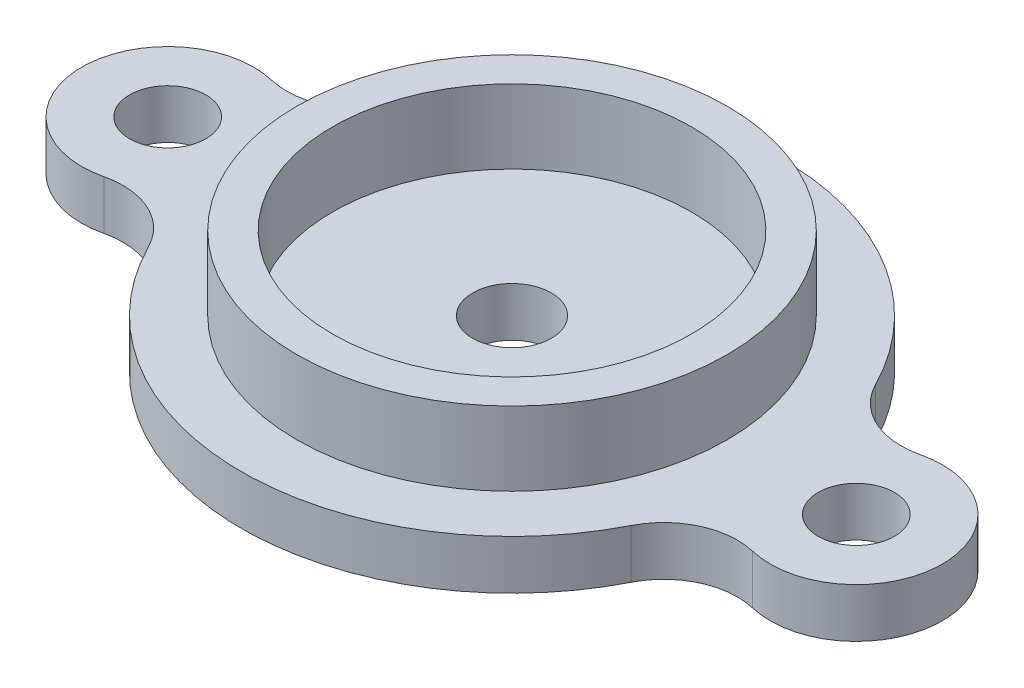
ISO-10303-21;
HEADER;
FILE_DESCRIPTION(('STEP AP214'),'2;1');
FILE_NAME('part.step','',(''),(''),'','','');
FILE_SCHEMA(('AUTOMOTIVE_DESIGN { 1 0 10303 214 1 1 1 1 }'));
ENDSEC;
DATA;
#1=APPLICATION_CONTEXT('core data for automotive mechanical design processes');
#2=APPLICATION_PROTOCOL_DEFINITION('international standard','automotive_design',2000,#1);
#3=PRODUCT_CONTEXT('',#1,'mechanical');
#4=PRODUCT('Part','Part','',(#3));
#5=PRODUCT_RELATED_PRODUCT_CATEGORY('part','',(#4));
#6=PRODUCT_DEFINITION_FORMATION('','',#4);
#7=PRODUCT_DEFINITION_CONTEXT('part definition',#1,'design');
#8=PRODUCT_DEFINITION('design','',#6,#7);
#9=PRODUCT_DEFINITION_SHAPE('','',#8);
#10=(LENGTH_UNIT() NAMED_UNIT(*) SI_UNIT(.MILLI.,.METRE.));
#11=(NAMED_UNIT(*) PLANE_ANGLE_UNIT() SI_UNIT($,.RADIAN.));
#12=(NAMED_UNIT(*) SI_UNIT($,.STERADIAN.) SOLID_ANGLE_UNIT());
#13=UNCERTAINTY_MEASURE_WITH_UNIT(LENGTH_MEASURE(1.E-05),#10,'distance_accuracy_value','');
#14=(GEOMETRIC_REPRESENTATION_CONTEXT(3) GLOBAL_UNCERTAINTY_ASSIGNED_CONTEXT((#13)) GLOBAL_UNIT_ASSIGNED_CONTEXT((#10,
#11,#12)) REPRESENTATION_CONTEXT('',''));
#15=CARTESIAN_POINT('',(0.,0.,0.));
#16=DIRECTION('',(0.,0.,1.));
#17=DIRECTION('',(1.,0.,0.));
#18=AXIS2_PLACEMENT_3D('',#15,#16,#17);
#19=CARTESIAN_POINT('',(0.,2.,0.));
#20=DIRECTION('',(0.,1.,0.));
#21=DIRECTION('',(0.,0.,1.));
#22=AXIS2_PLACEMENT_3D('',#19,#20,#21);
#23=PLANE('',#22);
#24=CARTESIAN_POINT('',(0.,2.,0.));
#25=DIRECTION('',(0.,1.,0.));
#26=DIRECTION('',(0.,0.,1.));
#27=AXIS2_PLACEMENT_3D('',#24,#25,#26);
#28=CIRCLE('',#27,1.6);
#29=CARTESIAN_POINT('',(0.,2.,1.6));
#30=VERTEX_POINT('',#29);
#31=EDGE_CURVE('E199',#30,#30,#28,.F.);
#32=ORIENTED_EDGE('',*,*,#31,.T.);
#33=EDGE_LOOP('',(#32));
#34=FACE_BOUND('',#33,.T.);
#35=CARTESIAN_POINT('',(0.,2.,0.));
#36=DIRECTION('',(0.,1.,0.));
#37=DIRECTION('',(0.,0.,1.));
#38=AXIS2_PLACEMENT_3D('',#35,#36,#37);
#39=CIRCLE('',#38,7.3);
#40=CARTESIAN_POINT('',(0.,2.,7.3));
#41=VERTEX_POINT('',#40);
#42=EDGE_CURVE('E11',#41,#41,#39,.F.);
#43=ORIENTED_EDGE('',*,*,#42,.F.);
#44=EDGE_LOOP('',(#43));
#45=FACE_BOUND('',#44,.T.);
#46=ADVANCED_FACE('F34',(#34,#45),#23,.T.);
#47=CARTESIAN_POINT('',(0.,2.,0.));
#48=DIRECTION('',(0.,-1.,0.));
#49=DIRECTION('',(0.,0.,-1.));
#50=AXIS2_PLACEMENT_3D('',#47,#48,#49);
#51=CYLINDRICAL_SURFACE('',#50,11.);
#52=DIRECTION('',(0.,1.,0.));
#53=VECTOR('',#52,1.);
#54=CARTESIAN_POINT('',(9.8144132653061,-12.5609479135786,-4.96762440788186));
#55=LINE('',#54,#53);
#56=CARTESIAN_POINT('',(9.8144132653061,0.,-4.96762440788186));
#57=VERTEX_POINT('',#56);
#58=CARTESIAN_POINT('',(9.8144132653061,2.,-4.96762440788186));
#59=VERTEX_POINT('',#58);
#60=EDGE_CURVE('E111',#57,#59,#55,.T.);
#61=ORIENTED_EDGE('',*,*,#60,.F.);
#62=CARTESIAN_POINT('',(0.,0.,0.));
#63=DIRECTION('',(0.,1.,0.));
#64=DIRECTION('',(0.,0.,1.));
#65=AXIS2_PLACEMENT_3D('',#62,#63,#64);
#66=CIRCLE('',#65,11.);
#67=CARTESIAN_POINT('',(-9.8144132653061,0.,-4.96762440788186));
#68=VERTEX_POINT('',#67);
#69=EDGE_CURVE('E170',#57,#68,#66,.T.);
#70=ORIENTED_EDGE('',*,*,#69,.T.);
#71=DIRECTION('',(0.,1.,0.));
#72=VECTOR('',#71,1.);
#73=CARTESIAN_POINT('',(-9.8144132653061,-12.5609479135786,-4.96762440788186));
#74=LINE('',#73,#72);
#75=CARTESIAN_POINT('',(-9.8144132653061,2.,-4.96762440788186));
#76=VERTEX_POINT('',#75);
#77=EDGE_CURVE('E162',#68,#76,#74,.T.);
#78=ORIENTED_EDGE('',*,*,#77,.T.);
#79=CARTESIAN_POINT('',(0.,2.,0.));
#80=DIRECTION('',(0.,1.,0.));
#81=DIRECTION('',(0.,0.,1.));
#82=AXIS2_PLACEMENT_3D('',#79,#80,#81);
#83=CIRCLE('',#82,11.);
#84=EDGE_CURVE('E49',#59,#76,#83,.T.);
#85=ORIENTED_EDGE('',*,*,#84,.F.);
#86=EDGE_LOOP('',(#61,#70,#78,#85));
#87=FACE_BOUND('',#86,.T.);
#88=ADVANCED_FACE('F174',(#87),#51,.T.);
#89=CARTESIAN_POINT('',(-9.81441326530612,0.,4.96762440788178));
#90=VERTEX_POINT('',#89);
#91=CARTESIAN_POINT('',(9.81441326530614,0.,4.96762440788179));
#92=VERTEX_POINT('',#91);
#93=EDGE_CURVE('E171',#90,#92,#66,.T.);
#94=ORIENTED_EDGE('',*,*,#93,.T.);
#95=DIRECTION('',(0.,1.,0.));
#96=VECTOR('',#95,1.);
#97=CARTESIAN_POINT('',(9.81441326530614,-12.5609479135786,4.96762440788179));
#98=LINE('',#97,#96);
#99=CARTESIAN_POINT('',(9.81441326530614,2.,4.96762440788179));
#100=VERTEX_POINT('',#99);
#101=EDGE_CURVE('E57',#92,#100,#98,.T.);
#102=ORIENTED_EDGE('',*,*,#101,.T.);
#103=CARTESIAN_POINT('',(-9.81441326530614,2.,4.96762440788179));
#104=VERTEX_POINT('',#103);
#105=EDGE_CURVE('E42',#104,#100,#83,.T.);
#106=ORIENTED_EDGE('',*,*,#105,.F.);
#107=DIRECTION('',(0.,1.,0.));
#108=VECTOR('',#107,1.);
#109=CARTESIAN_POINT('',(-9.81441326530612,-12.5609479135786,4.96762440788178));
#110=LINE('',#109,#108);
#111=EDGE_CURVE('E164',#90,#104,#110,.T.);
#112=ORIENTED_EDGE('',*,*,#111,.F.);
#113=EDGE_LOOP('',(#94,#102,#106,#112));
#114=FACE_BOUND('',#113,.T.);
#115=ADVANCED_FACE('F36',(#114),#51,.T.);
#116=CARTESIAN_POINT('',(0.,2.,0.));
#117=DIRECTION('',(0.,1.,0.));
#118=DIRECTION('',(0.,0.,1.));
#119=AXIS2_PLACEMENT_3D('',#116,#117,#118);
#120=CIRCLE('',#119,8.75);
#121=CARTESIAN_POINT('',(0.,2.,8.75));
#122=VERTEX_POINT('',#121);
#123=EDGE_CURVE('E205',#122,#122,#120,.T.);
#124=ORIENTED_EDGE('',*,*,#123,.F.);
#125=EDGE_LOOP('',(#124));
#126=FACE_BOUND('',#125,.T.);
#127=ORIENTED_EDGE('',*,*,#105,.T.);
#128=CARTESIAN_POINT('',(12.4910714285714,2.,6.32243106457683));
#129=DIRECTION('',(0.,-1.,0.));
#130=DIRECTION('',(0.,0.,1.));
#131=AXIS2_PLACEMENT_3D('',#128,#129,#130);
#132=CIRCLE('',#131,3.);
#133=CARTESIAN_POINT('',(13.1875,2.,3.40438595784904));
#134=VERTEX_POINT('',#133);
#135=EDGE_CURVE('E112',#100,#134,#132,.T.);
#136=ORIENTED_EDGE('',*,*,#135,.T.);
#137=CARTESIAN_POINT('',(14.,2.,0.));
#138=DIRECTION('',(0.,1.,0.));
#139=DIRECTION('',(0.,0.,-1.));
#140=AXIS2_PLACEMENT_3D('',#137,#138,#139);
#141=CIRCLE('',#140,3.5);
#142=CARTESIAN_POINT('',(13.1875,2.,-3.40438595784912));
#143=VERTEX_POINT('',#142);
#144=EDGE_CURVE('E106',#134,#143,#141,.T.);
#145=ORIENTED_EDGE('',*,*,#144,.T.);
#146=CARTESIAN_POINT('',(12.4910714285714,2.,-6.32243106457694));
#147=DIRECTION('',(0.,-1.,0.));
#148=DIRECTION('',(0.,0.,-1.));
#149=AXIS2_PLACEMENT_3D('',#146,#147,#148);
#150=CIRCLE('',#149,3.00000000000004);
#151=EDGE_CURVE('E115',#143,#59,#150,.T.);
#152=ORIENTED_EDGE('',*,*,#151,.T.);
#153=ORIENTED_EDGE('',*,*,#84,.T.);
#154=CARTESIAN_POINT('',(-12.4910714285714,2.,-6.32243106457691));
#155=DIRECTION('',(0.,-1.,0.));
#156=DIRECTION('',(0.,0.,1.));
#157=AXIS2_PLACEMENT_3D('',#154,#155,#156);
#158=CIRCLE('',#157,3.);
#159=CARTESIAN_POINT('',(-13.1875,2.,-3.40438595784913));
#160=VERTEX_POINT('',#159);
#161=EDGE_CURVE('E157',#76,#160,#158,.T.);
#162=ORIENTED_EDGE('',*,*,#161,.T.);
#163=CARTESIAN_POINT('',(-14.,2.,0.));
#164=DIRECTION('',(0.,1.,0.));
#165=DIRECTION('',(0.,0.,1.));
#166=AXIS2_PLACEMENT_3D('',#163,#164,#165);
#167=CIRCLE('',#166,3.5);
#168=CARTESIAN_POINT('',(-13.1875,2.,3.40438595784904));
#169=VERTEX_POINT('',#168);
#170=EDGE_CURVE('E151',#160,#169,#167,.T.);
#171=ORIENTED_EDGE('',*,*,#170,.T.);
#172=CARTESIAN_POINT('',(-12.4910714285714,2.,6.32243106457682));
#173=DIRECTION('',(0.,-1.,0.));
#174=DIRECTION('',(0.,0.,-1.));
#175=AXIS2_PLACEMENT_3D('',#172,#173,#174);
#176=CIRCLE('',#175,3.);
#177=EDGE_CURVE('E154',#169,#104,#176,.T.);
#178=ORIENTED_EDGE('',*,*,#177,.T.);
#179=EDGE_LOOP('',(#127,#136,#145,#152,#153,#162,#171,#178));
#180=FACE_BOUND('',#179,.T.);
#181=CARTESIAN_POINT('',(-14.,2.,0.));
#182=DIRECTION('',(0.,1.,0.));
#183=DIRECTION('',(0.,0.,1.));
#184=AXIS2_PLACEMENT_3D('',#181,#182,#183);
#185=CIRCLE('',#184,1.55);
#186=CARTESIAN_POINT('',(-14.,2.,1.54999999999996));
#187=VERTEX_POINT('',#186);
#188=EDGE_CURVE('E138',#187,#187,#185,.T.);
#189=ORIENTED_EDGE('',*,*,#188,.F.);
#190=EDGE_LOOP('',(#189));
#191=FACE_BOUND('',#190,.T.);
#192=CARTESIAN_POINT('',(14.,2.,0.));
#193=DIRECTION('',(0.,1.,0.));
#194=DIRECTION('',(0.,0.,1.));
#195=AXIS2_PLACEMENT_3D('',#192,#193,#194);
#196=CIRCLE('',#195,1.55);
#197=CARTESIAN_POINT('',(14.,2.,1.54999999999996));
#198=VERTEX_POINT('',#197);
#199=EDGE_CURVE('E122',#198,#198,#196,.T.);
#200=ORIENTED_EDGE('',*,*,#199,.F.);
#201=EDGE_LOOP('',(#200));
#202=FACE_BOUND('',#201,.T.);
#203=ADVANCED_FACE('F119',(#126,#180,#191,#202),#23,.T.);
#204=CARTESIAN_POINT('',(0.,0.,0.));
#205=DIRECTION('',(0.,1.,0.));
#206=DIRECTION('',(0.,0.,1.));
#207=AXIS2_PLACEMENT_3D('',#204,#205,#206);
#208=PLANE('',#207);
#209=CARTESIAN_POINT('',(0.,0.,0.));
#210=DIRECTION('',(0.,-1.,0.));
#211=DIRECTION('',(0.,0.,-1.));
#212=AXIS2_PLACEMENT_3D('',#209,#210,#211);
#213=CIRCLE('',#212,1.6);
#214=CARTESIAN_POINT('',(0.,0.,-1.6));
#215=VERTEX_POINT('',#214);
#216=EDGE_CURVE('E125',#215,#215,#213,.T.);
#217=ORIENTED_EDGE('',*,*,#216,.F.);
#218=EDGE_LOOP('',(#217));
#219=FACE_BOUND('',#218,.T.);
#220=ORIENTED_EDGE('',*,*,#93,.F.);
#221=CARTESIAN_POINT('',(-12.4910714285714,0.,6.32243106457682));
#222=DIRECTION('',(0.,1.,0.));
#223=DIRECTION('',(0.,0.,1.));
#224=AXIS2_PLACEMENT_3D('',#221,#222,#223);
#225=CIRCLE('',#224,3.);
#226=CARTESIAN_POINT('',(-13.1875,0.,3.40438595784904));
#227=VERTEX_POINT('',#226);
#228=EDGE_CURVE('E140',#90,#227,#225,.T.);
#229=ORIENTED_EDGE('',*,*,#228,.T.);
#230=CARTESIAN_POINT('',(-14.,0.,0.));
#231=DIRECTION('',(0.,1.,0.));
#232=DIRECTION('',(0.,0.,1.));
#233=AXIS2_PLACEMENT_3D('',#230,#231,#232);
#234=CIRCLE('',#233,3.5);
#235=CARTESIAN_POINT('',(-13.1875,0.,-3.40438595784913));
#236=VERTEX_POINT('',#235);
#237=EDGE_CURVE('E143',#227,#236,#234,.F.);
#238=ORIENTED_EDGE('',*,*,#237,.T.);
#239=CARTESIAN_POINT('',(-12.4910714285714,0.,-6.32243106457691));
#240=DIRECTION('',(0.,1.,0.));
#241=DIRECTION('',(0.,0.,1.));
#242=AXIS2_PLACEMENT_3D('',#239,#240,#241);
#243=CIRCLE('',#242,3.);
#244=EDGE_CURVE('E144',#236,#68,#243,.T.);
#245=ORIENTED_EDGE('',*,*,#244,.T.);
#246=ORIENTED_EDGE('',*,*,#69,.F.);
#247=CARTESIAN_POINT('',(12.4910714285714,0.,-6.32243106457694));
#248=DIRECTION('',(0.,1.,0.));
#249=DIRECTION('',(0.,0.,1.));
#250=AXIS2_PLACEMENT_3D('',#247,#248,#249);
#251=CIRCLE('',#250,3.00000000000004);
#252=CARTESIAN_POINT('',(13.1875,0.,-3.40438595784912));
#253=VERTEX_POINT('',#252);
#254=EDGE_CURVE('E139',#57,#253,#251,.T.);
#255=ORIENTED_EDGE('',*,*,#254,.T.);
#256=CARTESIAN_POINT('',(14.,0.,0.));
#257=DIRECTION('',(0.,1.,0.));
#258=DIRECTION('',(0.,0.,1.));
#259=AXIS2_PLACEMENT_3D('',#256,#257,#258);
#260=CIRCLE('',#259,3.5);
#261=CARTESIAN_POINT('',(13.1875,0.,3.40438595784904));
#262=VERTEX_POINT('',#261);
#263=EDGE_CURVE('E108',#253,#262,#260,.F.);
#264=ORIENTED_EDGE('',*,*,#263,.T.);
#265=CARTESIAN_POINT('',(12.4910714285714,0.,6.32243106457683));
#266=DIRECTION('',(0.,1.,0.));
#267=DIRECTION('',(0.,0.,1.));
#268=AXIS2_PLACEMENT_3D('',#265,#266,#267);
#269=CIRCLE('',#268,3.);
#270=EDGE_CURVE('E132',#262,#92,#269,.T.);
#271=ORIENTED_EDGE('',*,*,#270,.T.);
#272=EDGE_LOOP('',(#220,#229,#238,#245,#246,#255,#264,#271));
#273=FACE_BOUND('',#272,.T.);
#274=CARTESIAN_POINT('',(-14.,0.,0.));
#275=DIRECTION('',(0.,1.,0.));
#276=DIRECTION('',(0.,0.,1.));
#277=AXIS2_PLACEMENT_3D('',#274,#275,#276);
#278=CIRCLE('',#277,1.55);
#279=CARTESIAN_POINT('',(-14.,0.,1.54999999999996));
#280=VERTEX_POINT('',#279);
#281=EDGE_CURVE('E142',#280,#280,#278,.F.);
#282=ORIENTED_EDGE('',*,*,#281,.F.);
#283=EDGE_LOOP('',(#282));
#284=FACE_BOUND('',#283,.T.);
#285=CARTESIAN_POINT('',(14.,0.,0.));
#286=DIRECTION('',(0.,1.,0.));
#287=DIRECTION('',(0.,0.,1.));
#288=AXIS2_PLACEMENT_3D('',#285,#286,#287);
#289=CIRCLE('',#288,1.55);
#290=CARTESIAN_POINT('',(14.,0.,1.54999999999996));
#291=VERTEX_POINT('',#290);
#292=EDGE_CURVE('E135',#291,#291,#289,.F.);
#293=ORIENTED_EDGE('',*,*,#292,.F.);
#294=EDGE_LOOP('',(#293));
#295=FACE_BOUND('',#294,.T.);
#296=ADVANCED_FACE('F179',(#219,#273,#284,#295),#208,.F.);
#297=CARTESIAN_POINT('',(-12.4910714285714,-12.5609479135786,6.32243106457682));
#298=DIRECTION('',(0.,1.,0.));
#299=DIRECTION('',(0.,0.,1.));
#300=AXIS2_PLACEMENT_3D('',#297,#298,#299);
#301=CYLINDRICAL_SURFACE('',#300,3.);
#302=ORIENTED_EDGE('',*,*,#228,.F.);
#303=ORIENTED_EDGE('',*,*,#111,.T.);
#304=ORIENTED_EDGE('',*,*,#177,.F.);
#305=DIRECTION('',(0.,1.,0.));
#306=VECTOR('',#305,1.);
#307=CARTESIAN_POINT('',(-13.1875,-12.5609479135786,3.40438595784904));
#308=LINE('',#307,#306);
#309=EDGE_CURVE('E160',#227,#169,#308,.T.);
#310=ORIENTED_EDGE('',*,*,#309,.F.);
#311=EDGE_LOOP('',(#302,#303,#304,#310));
#312=FACE_BOUND('',#311,.T.);
#313=ADVANCED_FACE('F192',(#312),#301,.F.);
#314=CARTESIAN_POINT('',(-12.4910714285714,-12.5609479135786,-6.32243106457691));
#315=DIRECTION('',(0.,1.,0.));
#316=DIRECTION('',(0.,0.,1.));
#317=AXIS2_PLACEMENT_3D('',#314,#315,#316);
#318=CYLINDRICAL_SURFACE('',#317,3.);
#319=ORIENTED_EDGE('',*,*,#244,.F.);
#320=DIRECTION('',(0.,1.,0.));
#321=VECTOR('',#320,1.);
#322=CARTESIAN_POINT('',(-13.1875,-12.5609479135786,-3.40438595784913));
#323=LINE('',#322,#321);
#324=EDGE_CURVE('E147',#236,#160,#323,.T.);
#325=ORIENTED_EDGE('',*,*,#324,.T.);
#326=ORIENTED_EDGE('',*,*,#161,.F.);
#327=ORIENTED_EDGE('',*,*,#77,.F.);
#328=EDGE_LOOP('',(#319,#325,#326,#327));
#329=FACE_BOUND('',#328,.T.);
#330=ADVANCED_FACE('F184',(#329),#318,.F.);
#331=CARTESIAN_POINT('',(-14.,-12.5609479135786,0.));
#332=DIRECTION('',(0.,1.,0.));
#333=DIRECTION('',(0.,0.,1.));
#334=AXIS2_PLACEMENT_3D('',#331,#332,#333);
#335=CYLINDRICAL_SURFACE('',#334,3.5);
#336=ORIENTED_EDGE('',*,*,#237,.F.);
#337=ORIENTED_EDGE('',*,*,#309,.T.);
#338=ORIENTED_EDGE('',*,*,#170,.F.);
#339=ORIENTED_EDGE('',*,*,#324,.F.);
#340=EDGE_LOOP('',(#336,#337,#338,#339));
#341=FACE_BOUND('',#340,.T.);
#342=ADVANCED_FACE('F188',(#341),#335,.T.);
#343=CARTESIAN_POINT('',(-14.,-12.5609479135786,0.));
#344=DIRECTION('',(0.,1.,0.));
#345=DIRECTION('',(0.,0.,1.));
#346=AXIS2_PLACEMENT_3D('',#343,#344,#345);
#347=CYLINDRICAL_SURFACE('',#346,1.55);
#348=ORIENTED_EDGE('',*,*,#281,.T.);
#349=EDGE_LOOP('',(#348));
#350=FACE_BOUND('',#349,.T.);
#351=ORIENTED_EDGE('',*,*,#188,.T.);
#352=EDGE_LOOP('',(#351));
#353=FACE_BOUND('',#352,.T.);
#354=ADVANCED_FACE('F305',(#350,#353),#347,.F.);
#355=CARTESIAN_POINT('',(12.4910714285714,-12.5609479135786,-6.32243106457694));
#356=DIRECTION('',(0.,1.,0.));
#357=DIRECTION('',(0.,0.,1.));
#358=AXIS2_PLACEMENT_3D('',#355,#356,#357);
#359=CYLINDRICAL_SURFACE('',#358,3.00000000000004);
#360=ORIENTED_EDGE('',*,*,#254,.F.);
#361=ORIENTED_EDGE('',*,*,#60,.T.);
#362=ORIENTED_EDGE('',*,*,#151,.F.);
#363=DIRECTION('',(0.,1.,0.));
#364=VECTOR('',#363,1.);
#365=CARTESIAN_POINT('',(13.1875,-12.5609479135786,-3.40438595784912));
#366=LINE('',#365,#364);
#367=EDGE_CURVE('E101',#253,#143,#366,.T.);
#368=ORIENTED_EDGE('',*,*,#367,.F.);
#369=EDGE_LOOP('',(#360,#361,#362,#368));
#370=FACE_BOUND('',#369,.T.);
#371=ADVANCED_FACE('F116',(#370),#359,.F.);
#372=CARTESIAN_POINT('',(12.4910714285714,-12.5609479135786,6.32243106457683));
#373=DIRECTION('',(0.,1.,0.));
#374=DIRECTION('',(0.,0.,1.));
#375=AXIS2_PLACEMENT_3D('',#372,#373,#374);
#376=CYLINDRICAL_SURFACE('',#375,3.);
#377=ORIENTED_EDGE('',*,*,#270,.F.);
#378=DIRECTION('',(0.,1.,0.));
#379=VECTOR('',#378,1.);
#380=CARTESIAN_POINT('',(13.1875,-12.5609479135786,3.40438595784904));
#381=LINE('',#380,#379);
#382=EDGE_CURVE('E130',#262,#134,#381,.T.);
#383=ORIENTED_EDGE('',*,*,#382,.T.);
#384=ORIENTED_EDGE('',*,*,#135,.F.);
#385=ORIENTED_EDGE('',*,*,#101,.F.);
#386=EDGE_LOOP('',(#377,#383,#384,#385));
#387=FACE_BOUND('',#386,.T.);
#388=ADVANCED_FACE('F195',(#387),#376,.F.);
#389=CARTESIAN_POINT('',(14.,-12.5609479135786,0.));
#390=DIRECTION('',(0.,1.,0.));
#391=DIRECTION('',(0.,0.,1.));
#392=AXIS2_PLACEMENT_3D('',#389,#390,#391);
#393=CYLINDRICAL_SURFACE('',#392,3.5);
#394=ORIENTED_EDGE('',*,*,#263,.F.);
#395=ORIENTED_EDGE('',*,*,#367,.T.);
#396=ORIENTED_EDGE('',*,*,#144,.F.);
#397=ORIENTED_EDGE('',*,*,#382,.F.);
#398=EDGE_LOOP('',(#394,#395,#396,#397));
#399=FACE_BOUND('',#398,.T.);
#400=ADVANCED_FACE('F103',(#399),#393,.T.);
#401=CARTESIAN_POINT('',(14.,-12.5609479135786,0.));
#402=DIRECTION('',(0.,1.,0.));
#403=DIRECTION('',(0.,0.,1.));
#404=AXIS2_PLACEMENT_3D('',#401,#402,#403);
#405=CYLINDRICAL_SURFACE('',#404,1.55);
#406=ORIENTED_EDGE('',*,*,#292,.T.);
#407=EDGE_LOOP('',(#406));
#408=FACE_BOUND('',#407,.T.);
#409=ORIENTED_EDGE('',*,*,#199,.T.);
#410=EDGE_LOOP('',(#409));
#411=FACE_BOUND('',#410,.T.);
#412=ADVANCED_FACE('F229',(#408,#411),#405,.F.);
#413=CARTESIAN_POINT('',(0.,2.001,0.));
#414=DIRECTION('',(0.,-1.,0.));
#415=DIRECTION('',(0.,0.,-1.));
#416=AXIS2_PLACEMENT_3D('',#413,#414,#415);
#417=CYLINDRICAL_SURFACE('',#416,1.6);
#418=ORIENTED_EDGE('',*,*,#31,.F.);
#419=EDGE_LOOP('',(#418));
#420=FACE_BOUND('',#419,.T.);
#421=ORIENTED_EDGE('',*,*,#216,.T.);
#422=EDGE_LOOP('',(#421));
#423=FACE_BOUND('',#422,.T.);
#424=ADVANCED_FACE('F220',(#420,#423),#417,.F.);
#425=CARTESIAN_POINT('',(0.,5.,0.));
#426=DIRECTION('',(0.,1.,0.));
#427=DIRECTION('',(0.,0.,1.));
#428=AXIS2_PLACEMENT_3D('',#425,#426,#427);
#429=PLANE('',#428);
#430=CARTESIAN_POINT('',(0.,5.,0.));
#431=DIRECTION('',(0.,1.,0.));
#432=DIRECTION('',(0.,0.,1.));
#433=AXIS2_PLACEMENT_3D('',#430,#431,#432);
#434=CIRCLE('',#433,8.75);
#435=CARTESIAN_POINT('',(0.,5.,8.75));
#436=VERTEX_POINT('',#435);
#437=EDGE_CURVE('E202',#436,#436,#434,.T.);
#438=ORIENTED_EDGE('',*,*,#437,.T.);
#439=EDGE_LOOP('',(#438));
#440=FACE_BOUND('',#439,.T.);
#441=CARTESIAN_POINT('',(0.,5.,0.));
#442=DIRECTION('',(0.,1.,0.));
#443=DIRECTION('',(0.,0.,1.));
#444=AXIS2_PLACEMENT_3D('',#441,#442,#443);
#445=CIRCLE('',#444,7.3);
#446=CARTESIAN_POINT('',(0.,5.,7.3));
#447=VERTEX_POINT('',#446);
#448=EDGE_CURVE('E208',#447,#447,#445,.T.);
#449=ORIENTED_EDGE('',*,*,#448,.F.);
#450=EDGE_LOOP('',(#449));
#451=FACE_BOUND('',#450,.T.);
#452=ADVANCED_FACE('F217',(#440,#451),#429,.T.);
#453=CARTESIAN_POINT('',(0.,5.,0.));
#454=DIRECTION('',(0.,-1.,0.));
#455=DIRECTION('',(0.,0.,-1.));
#456=AXIS2_PLACEMENT_3D('',#453,#454,#455);
#457=CYLINDRICAL_SURFACE('',#456,8.75);
#458=ORIENTED_EDGE('',*,*,#437,.F.);
#459=EDGE_LOOP('',(#458));
#460=FACE_BOUND('',#459,.T.);
#461=ORIENTED_EDGE('',*,*,#123,.T.);
#462=EDGE_LOOP('',(#461));
#463=FACE_BOUND('',#462,.T.);
#464=ADVANCED_FACE('F219',(#460,#463),#457,.T.);
#465=CARTESIAN_POINT('',(0.,5.,0.));
#466=DIRECTION('',(0.,-1.,0.));
#467=DIRECTION('',(0.,0.,-1.));
#468=AXIS2_PLACEMENT_3D('',#465,#466,#467);
#469=CYLINDRICAL_SURFACE('',#468,7.3);
#470=ORIENTED_EDGE('',*,*,#448,.T.);
#471=EDGE_LOOP('',(#470));
#472=FACE_BOUND('',#471,.T.);
#473=ORIENTED_EDGE('',*,*,#42,.T.);
#474=EDGE_LOOP('',(#473));
#475=FACE_BOUND('',#474,.T.);
#476=ADVANCED_FACE('F214',(#472,#475),#469,.F.);
#477=CLOSED_SHELL('',(#46,#88,#115,#203,#296,#313,#330,#342,#354,#371,#388,#400,#412,#424,#452,
#464,#476));
#478=MANIFOLD_SOLID_BREP('B2',#477);
#479=ADVANCED_BREP_SHAPE_REPRESENTATION('',(#18,#478),#14);
#480=SHAPE_DEFINITION_REPRESENTATION(#9,#479);
ENDSEC;
END-ISO-10303-21;
